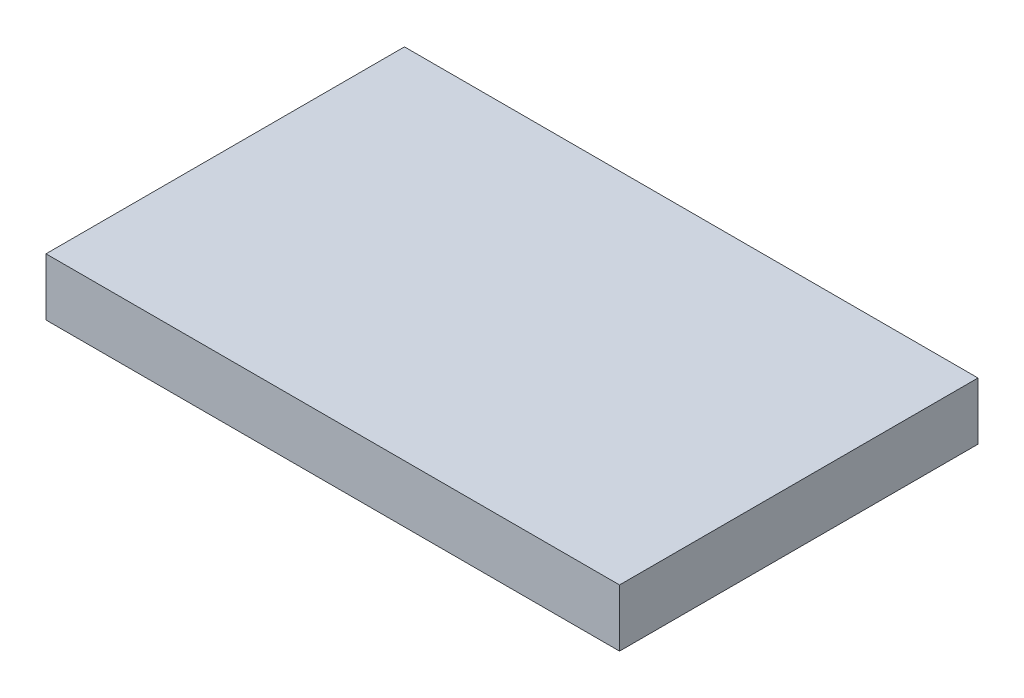
ISO-10303-21;
HEADER;
FILE_DESCRIPTION(('STEP AP214'),'2;1');
FILE_NAME('part.step','',(''),(''),'','','');
FILE_SCHEMA(('AUTOMOTIVE_DESIGN { 1 0 10303 214 1 1 1 1 }'));
ENDSEC;
DATA;
#1=APPLICATION_CONTEXT('core data for automotive mechanical design processes');
#2=APPLICATION_PROTOCOL_DEFINITION('international standard','automotive_design',2000,#1);
#3=PRODUCT_CONTEXT('',#1,'mechanical');
#4=PRODUCT('Part','Part','',(#3));
#5=PRODUCT_RELATED_PRODUCT_CATEGORY('part','',(#4));
#6=PRODUCT_DEFINITION_FORMATION('','',#4);
#7=PRODUCT_DEFINITION_CONTEXT('part definition',#1,'design');
#8=PRODUCT_DEFINITION('design','',#6,#7);
#9=PRODUCT_DEFINITION_SHAPE('','',#8);
#10=(LENGTH_UNIT() NAMED_UNIT(*) SI_UNIT(.MILLI.,.METRE.));
#11=(NAMED_UNIT(*) PLANE_ANGLE_UNIT() SI_UNIT($,.RADIAN.));
#12=(NAMED_UNIT(*) SI_UNIT($,.STERADIAN.) SOLID_ANGLE_UNIT());
#13=UNCERTAINTY_MEASURE_WITH_UNIT(LENGTH_MEASURE(1.E-05),#10,'distance_accuracy_value','');
#14=(GEOMETRIC_REPRESENTATION_CONTEXT(3) GLOBAL_UNCERTAINTY_ASSIGNED_CONTEXT((#13)) GLOBAL_UNIT_ASSIGNED_CONTEXT((#10,
#11,#12)) REPRESENTATION_CONTEXT('',''));
#15=CARTESIAN_POINT('',(0.,0.,0.));
#16=DIRECTION('',(0.,0.,1.));
#17=DIRECTION('',(1.,0.,0.));
#18=AXIS2_PLACEMENT_3D('',#15,#16,#17);
#19=CARTESIAN_POINT('',(0.,2.,0.));
#20=DIRECTION('',(1.,0.,0.));
#21=DIRECTION('',(0.,0.,-1.));
#22=AXIS2_PLACEMENT_3D('',#19,#20,#21);
#23=PLANE('',#22);
#24=DIRECTION('',(0.,0.,1.));
#25=VECTOR('',#24,1.);
#26=CARTESIAN_POINT('',(0.,0.,0.));
#27=LINE('',#26,#25);
#28=CARTESIAN_POINT('',(0.,0.,0.));
#29=VERTEX_POINT('',#28);
#30=CARTESIAN_POINT('',(0.,0.,12.5));
#31=VERTEX_POINT('',#30);
#32=EDGE_CURVE('E96',#29,#31,#27,.T.);
#33=ORIENTED_EDGE('',*,*,#32,.T.);
#34=DIRECTION('',(0.,-1.,0.));
#35=VECTOR('',#34,1.);
#36=CARTESIAN_POINT('',(0.,2.,12.5));
#37=LINE('',#36,#35);
#38=CARTESIAN_POINT('',(0.,2.,12.5));
#39=VERTEX_POINT('',#38);
#40=EDGE_CURVE('E11',#39,#31,#37,.T.);
#41=ORIENTED_EDGE('',*,*,#40,.F.);
#42=DIRECTION('',(0.,0.,1.));
#43=VECTOR('',#42,1.);
#44=CARTESIAN_POINT('',(0.,2.,0.));
#45=LINE('',#44,#43);
#46=CARTESIAN_POINT('',(0.,2.,0.));
#47=VERTEX_POINT('',#46);
#48=EDGE_CURVE('E84',#47,#39,#45,.T.);
#49=ORIENTED_EDGE('',*,*,#48,.F.);
#50=DIRECTION('',(0.,-1.,0.));
#51=VECTOR('',#50,1.);
#52=CARTESIAN_POINT('',(0.,2.,0.));
#53=LINE('',#52,#51);
#54=EDGE_CURVE('E92',#47,#29,#53,.T.);
#55=ORIENTED_EDGE('',*,*,#54,.T.);
#56=EDGE_LOOP('',(#33,#41,#49,#55));
#57=FACE_BOUND('',#56,.T.);
#58=ADVANCED_FACE('F33',(#57),#23,.F.);
#59=CARTESIAN_POINT('',(0.,2.,12.5));
#60=DIRECTION('',(0.,0.,-1.));
#61=DIRECTION('',(-1.,0.,0.));
#62=AXIS2_PLACEMENT_3D('',#59,#60,#61);
#63=PLANE('',#62);
#64=DIRECTION('',(1.,0.,0.));
#65=VECTOR('',#64,1.);
#66=CARTESIAN_POINT('',(0.,0.,12.5));
#67=LINE('',#66,#65);
#68=CARTESIAN_POINT('',(20.,0.,12.5));
#69=VERTEX_POINT('',#68);
#70=EDGE_CURVE('E88',#31,#69,#67,.T.);
#71=ORIENTED_EDGE('',*,*,#70,.T.);
#72=DIRECTION('',(0.,-1.,0.));
#73=VECTOR('',#72,1.);
#74=CARTESIAN_POINT('',(20.,2.,12.5));
#75=LINE('',#74,#73);
#76=CARTESIAN_POINT('',(20.,2.,12.5));
#77=VERTEX_POINT('',#76);
#78=EDGE_CURVE('E41',#77,#69,#75,.T.);
#79=ORIENTED_EDGE('',*,*,#78,.F.);
#80=DIRECTION('',(1.,0.,0.));
#81=VECTOR('',#80,1.);
#82=CARTESIAN_POINT('',(0.,2.,12.5));
#83=LINE('',#82,#81);
#84=EDGE_CURVE('E79',#39,#77,#83,.T.);
#85=ORIENTED_EDGE('',*,*,#84,.F.);
#86=ORIENTED_EDGE('',*,*,#40,.T.);
#87=EDGE_LOOP('',(#71,#79,#85,#86));
#88=FACE_BOUND('',#87,.T.);
#89=ADVANCED_FACE('F87',(#88),#63,.F.);
#90=CARTESIAN_POINT('',(20.,2.,0.));
#91=DIRECTION('',(-1.,0.,0.));
#92=DIRECTION('',(0.,0.,1.));
#93=AXIS2_PLACEMENT_3D('',#90,#91,#92);
#94=PLANE('',#93);
#95=DIRECTION('',(0.,0.,-1.));
#96=VECTOR('',#95,1.);
#97=CARTESIAN_POINT('',(20.,0.,0.));
#98=LINE('',#97,#96);
#99=CARTESIAN_POINT('',(20.,0.,0.));
#100=VERTEX_POINT('',#99);
#101=EDGE_CURVE('E66',#69,#100,#98,.T.);
#102=ORIENTED_EDGE('',*,*,#101,.T.);
#103=DIRECTION('',(0.,-1.,0.));
#104=VECTOR('',#103,1.);
#105=CARTESIAN_POINT('',(20.,2.,0.));
#106=LINE('',#105,#104);
#107=CARTESIAN_POINT('',(20.,2.,0.));
#108=VERTEX_POINT('',#107);
#109=EDGE_CURVE('E89',#108,#100,#106,.T.);
#110=ORIENTED_EDGE('',*,*,#109,.F.);
#111=DIRECTION('',(0.,0.,-1.));
#112=VECTOR('',#111,1.);
#113=CARTESIAN_POINT('',(20.,2.,0.));
#114=LINE('',#113,#112);
#115=EDGE_CURVE('E82',#77,#108,#114,.T.);
#116=ORIENTED_EDGE('',*,*,#115,.F.);
#117=ORIENTED_EDGE('',*,*,#78,.T.);
#118=EDGE_LOOP('',(#102,#110,#116,#117));
#119=FACE_BOUND('',#118,.T.);
#120=ADVANCED_FACE('F90',(#119),#94,.F.);
#121=CARTESIAN_POINT('',(0.,2.,0.));
#122=DIRECTION('',(0.,0.,1.));
#123=DIRECTION('',(1.,0.,0.));
#124=AXIS2_PLACEMENT_3D('',#121,#122,#123);
#125=PLANE('',#124);
#126=DIRECTION('',(-1.,0.,0.));
#127=VECTOR('',#126,1.);
#128=CARTESIAN_POINT('',(0.,0.,0.));
#129=LINE('',#128,#127);
#130=EDGE_CURVE('E72',#100,#29,#129,.T.);
#131=ORIENTED_EDGE('',*,*,#130,.T.);
#132=ORIENTED_EDGE('',*,*,#54,.F.);
#133=DIRECTION('',(-1.,0.,0.));
#134=VECTOR('',#133,1.);
#135=CARTESIAN_POINT('',(0.,2.,0.));
#136=LINE('',#135,#134);
#137=EDGE_CURVE('E49',#108,#47,#136,.T.);
#138=ORIENTED_EDGE('',*,*,#137,.F.);
#139=ORIENTED_EDGE('',*,*,#109,.T.);
#140=EDGE_LOOP('',(#131,#132,#138,#139));
#141=FACE_BOUND('',#140,.T.);
#142=ADVANCED_FACE('F103',(#141),#125,.F.);
#143=CARTESIAN_POINT('',(0.,2.,0.));
#144=DIRECTION('',(0.,1.,0.));
#145=DIRECTION('',(0.,0.,1.));
#146=AXIS2_PLACEMENT_3D('',#143,#144,#145);
#147=PLANE('',#146);
#148=ORIENTED_EDGE('',*,*,#48,.T.);
#149=ORIENTED_EDGE('',*,*,#84,.T.);
#150=ORIENTED_EDGE('',*,*,#115,.T.);
#151=ORIENTED_EDGE('',*,*,#137,.T.);
#152=EDGE_LOOP('',(#148,#149,#150,#151));
#153=FACE_BOUND('',#152,.T.);
#154=ADVANCED_FACE('F80',(#153),#147,.T.);
#155=CARTESIAN_POINT('',(0.,0.,0.));
#156=DIRECTION('',(0.,1.,0.));
#157=DIRECTION('',(0.,0.,1.));
#158=AXIS2_PLACEMENT_3D('',#155,#156,#157);
#159=PLANE('',#158);
#160=ORIENTED_EDGE('',*,*,#32,.F.);
#161=ORIENTED_EDGE('',*,*,#130,.F.);
#162=ORIENTED_EDGE('',*,*,#101,.F.);
#163=ORIENTED_EDGE('',*,*,#70,.F.);
#164=EDGE_LOOP('',(#160,#161,#162,#163));
#165=FACE_BOUND('',#164,.T.);
#166=ADVANCED_FACE('F106',(#165),#159,.F.);
#167=CLOSED_SHELL('',(#58,#89,#120,#142,#154,#166));
#168=MANIFOLD_SOLID_BREP('B2',#167);
#169=ADVANCED_BREP_SHAPE_REPRESENTATION('',(#18,#168),#14);
#170=SHAPE_DEFINITION_REPRESENTATION(#9,#169);
ENDSEC;
END-ISO-10303-21;
